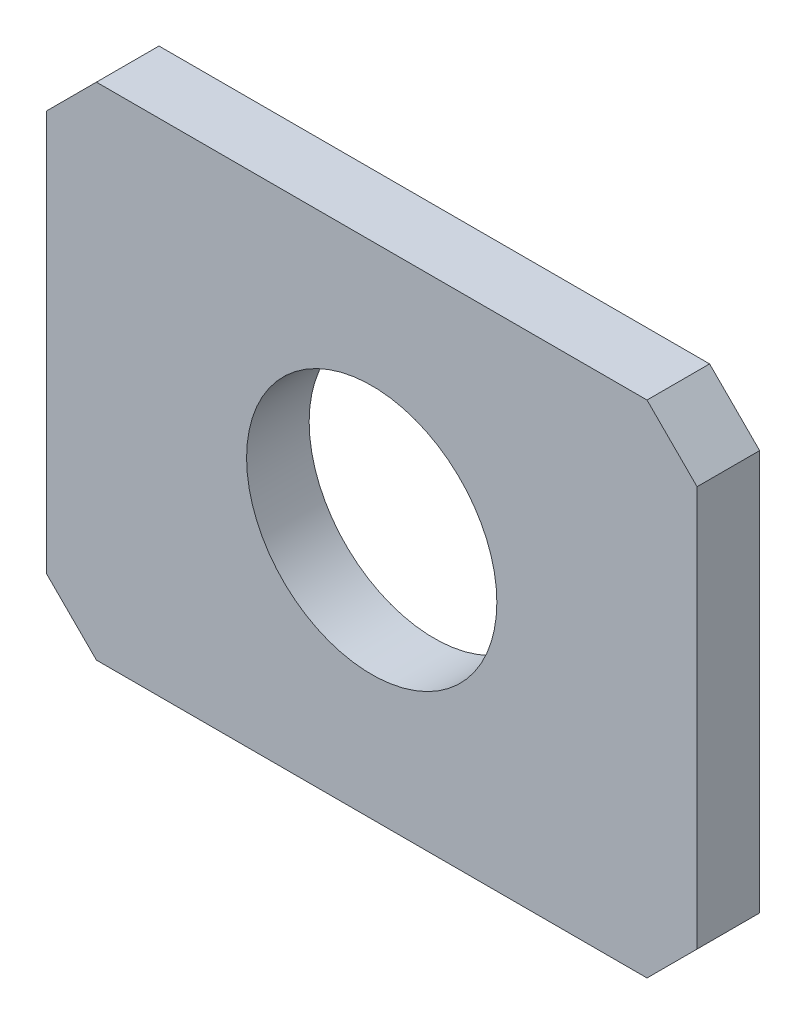
ISO-10303-21;
HEADER;
FILE_DESCRIPTION(('STEP AP214'),'2;1');
FILE_NAME('part.step','',(''),(''),'','','');
FILE_SCHEMA(('AUTOMOTIVE_DESIGN { 1 0 10303 214 1 1 1 1 }'));
ENDSEC;
DATA;
#1=APPLICATION_CONTEXT('core data for automotive mechanical design processes');
#2=APPLICATION_PROTOCOL_DEFINITION('international standard','automotive_design',2000,#1);
#3=PRODUCT_CONTEXT('',#1,'mechanical');
#4=PRODUCT('Part','Part','',(#3));
#5=PRODUCT_RELATED_PRODUCT_CATEGORY('part','',(#4));
#6=PRODUCT_DEFINITION_FORMATION('','',#4);
#7=PRODUCT_DEFINITION_CONTEXT('part definition',#1,'design');
#8=PRODUCT_DEFINITION('design','',#6,#7);
#9=PRODUCT_DEFINITION_SHAPE('','',#8);
#10=(LENGTH_UNIT() NAMED_UNIT(*) SI_UNIT(.MILLI.,.METRE.));
#11=(NAMED_UNIT(*) PLANE_ANGLE_UNIT() SI_UNIT($,.RADIAN.));
#12=(NAMED_UNIT(*) SI_UNIT($,.STERADIAN.) SOLID_ANGLE_UNIT());
#13=UNCERTAINTY_MEASURE_WITH_UNIT(LENGTH_MEASURE(1.E-05),#10,'distance_accuracy_value','');
#14=(GEOMETRIC_REPRESENTATION_CONTEXT(3) GLOBAL_UNCERTAINTY_ASSIGNED_CONTEXT((#13)) GLOBAL_UNIT_ASSIGNED_CONTEXT((#10,
#11,#12)) REPRESENTATION_CONTEXT('',''));
#15=CARTESIAN_POINT('',(0.,0.,0.));
#16=DIRECTION('',(0.,0.,1.));
#17=DIRECTION('',(1.,0.,0.));
#18=AXIS2_PLACEMENT_3D('',#15,#16,#17);
#19=CARTESIAN_POINT('',(78.,-60.,15.));
#20=DIRECTION('',(-1.,0.,0.));
#21=DIRECTION('',(0.,0.,1.));
#22=AXIS2_PLACEMENT_3D('',#19,#20,#21);
#23=PLANE('',#22);
#24=DIRECTION('',(0.,1.,0.));
#25=VECTOR('',#24,1.);
#26=CARTESIAN_POINT('',(78.,-60.,15.));
#27=LINE('',#26,#25);
#28=CARTESIAN_POINT('',(78.,-48.,15.));
#29=VERTEX_POINT('',#28);
#30=CARTESIAN_POINT('',(78.,48.,15.));
#31=VERTEX_POINT('',#30);
#32=EDGE_CURVE('E125',#29,#31,#27,.T.);
#33=ORIENTED_EDGE('',*,*,#32,.F.);
#34=DIRECTION('',(0.,0.,-1.));
#35=VECTOR('',#34,1.);
#36=CARTESIAN_POINT('',(78.,-48.,15.));
#37=LINE('',#36,#35);
#38=CARTESIAN_POINT('',(78.,-48.,0.));
#39=VERTEX_POINT('',#38);
#40=EDGE_CURVE('E151',#29,#39,#37,.T.);
#41=ORIENTED_EDGE('',*,*,#40,.T.);
#42=DIRECTION('',(0.,1.,0.));
#43=VECTOR('',#42,1.);
#44=CARTESIAN_POINT('',(78.,-60.,0.));
#45=LINE('',#44,#43);
#46=CARTESIAN_POINT('',(78.,48.,0.));
#47=VERTEX_POINT('',#46);
#48=EDGE_CURVE('E157',#39,#47,#45,.T.);
#49=ORIENTED_EDGE('',*,*,#48,.T.);
#50=DIRECTION('',(0.,0.,1.));
#51=VECTOR('',#50,1.);
#52=CARTESIAN_POINT('',(78.,48.,15.));
#53=LINE('',#52,#51);
#54=EDGE_CURVE('E149',#47,#31,#53,.T.);
#55=ORIENTED_EDGE('',*,*,#54,.T.);
#56=EDGE_LOOP('',(#33,#41,#49,#55));
#57=FACE_BOUND('',#56,.T.);
#58=ADVANCED_FACE('F33',(#57),#23,.F.);
#59=CARTESIAN_POINT('',(-78.,60.,15.));
#60=DIRECTION('',(0.,-1.,0.));
#61=DIRECTION('',(0.,0.,-1.));
#62=AXIS2_PLACEMENT_3D('',#59,#60,#61);
#63=PLANE('',#62);
#64=DIRECTION('',(-1.,0.,0.));
#65=VECTOR('',#64,1.);
#66=CARTESIAN_POINT('',(-78.,60.,15.));
#67=LINE('',#66,#65);
#68=CARTESIAN_POINT('',(66.,60.,15.));
#69=VERTEX_POINT('',#68);
#70=CARTESIAN_POINT('',(-66.,60.,15.));
#71=VERTEX_POINT('',#70);
#72=EDGE_CURVE('E128',#69,#71,#67,.T.);
#73=ORIENTED_EDGE('',*,*,#72,.F.);
#74=DIRECTION('',(0.,0.,-1.));
#75=VECTOR('',#74,1.);
#76=CARTESIAN_POINT('',(66.,60.,15.));
#77=LINE('',#76,#75);
#78=CARTESIAN_POINT('',(66.,60.,0.));
#79=VERTEX_POINT('',#78);
#80=EDGE_CURVE('E11',#69,#79,#77,.T.);
#81=ORIENTED_EDGE('',*,*,#80,.T.);
#82=DIRECTION('',(-1.,0.,0.));
#83=VECTOR('',#82,1.);
#84=CARTESIAN_POINT('',(-78.,60.,0.));
#85=LINE('',#84,#83);
#86=CARTESIAN_POINT('',(-66.,60.,0.));
#87=VERTEX_POINT('',#86);
#88=EDGE_CURVE('E130',#79,#87,#85,.T.);
#89=ORIENTED_EDGE('',*,*,#88,.T.);
#90=DIRECTION('',(0.,0.,1.));
#91=VECTOR('',#90,1.);
#92=CARTESIAN_POINT('',(-66.,60.,15.));
#93=LINE('',#92,#91);
#94=EDGE_CURVE('E41',#87,#71,#93,.T.);
#95=ORIENTED_EDGE('',*,*,#94,.T.);
#96=EDGE_LOOP('',(#73,#81,#89,#95));
#97=FACE_BOUND('',#96,.T.);
#98=ADVANCED_FACE('F187',(#97),#63,.F.);
#99=CARTESIAN_POINT('',(-78.,-60.,15.));
#100=DIRECTION('',(1.,0.,0.));
#101=DIRECTION('',(0.,0.,-1.));
#102=AXIS2_PLACEMENT_3D('',#99,#100,#101);
#103=PLANE('',#102);
#104=DIRECTION('',(0.,-1.,0.));
#105=VECTOR('',#104,1.);
#106=CARTESIAN_POINT('',(-78.,-60.,0.));
#107=LINE('',#106,#105);
#108=CARTESIAN_POINT('',(-78.,48.,0.));
#109=VERTEX_POINT('',#108);
#110=CARTESIAN_POINT('',(-78.,-48.,0.));
#111=VERTEX_POINT('',#110);
#112=EDGE_CURVE('E126',#109,#111,#107,.T.);
#113=ORIENTED_EDGE('',*,*,#112,.T.);
#114=DIRECTION('',(0.,0.,1.));
#115=VECTOR('',#114,1.);
#116=CARTESIAN_POINT('',(-78.,-48.,15.));
#117=LINE('',#116,#115);
#118=CARTESIAN_POINT('',(-78.,-48.,15.));
#119=VERTEX_POINT('',#118);
#120=EDGE_CURVE('E104',#111,#119,#117,.T.);
#121=ORIENTED_EDGE('',*,*,#120,.T.);
#122=DIRECTION('',(0.,-1.,0.));
#123=VECTOR('',#122,1.);
#124=CARTESIAN_POINT('',(-78.,-60.,15.));
#125=LINE('',#124,#123);
#126=CARTESIAN_POINT('',(-78.,48.,15.));
#127=VERTEX_POINT('',#126);
#128=EDGE_CURVE('E169',#127,#119,#125,.T.);
#129=ORIENTED_EDGE('',*,*,#128,.F.);
#130=DIRECTION('',(0.,0.,-1.));
#131=VECTOR('',#130,1.);
#132=CARTESIAN_POINT('',(-78.,48.,15.));
#133=LINE('',#132,#131);
#134=EDGE_CURVE('E109',#127,#109,#133,.T.);
#135=ORIENTED_EDGE('',*,*,#134,.T.);
#136=EDGE_LOOP('',(#113,#121,#129,#135));
#137=FACE_BOUND('',#136,.T.);
#138=ADVANCED_FACE('F185',(#137),#103,.F.);
#139=CARTESIAN_POINT('',(-78.,-60.,15.));
#140=DIRECTION('',(0.,1.,0.));
#141=DIRECTION('',(0.,0.,1.));
#142=AXIS2_PLACEMENT_3D('',#139,#140,#141);
#143=PLANE('',#142);
#144=DIRECTION('',(1.,0.,0.));
#145=VECTOR('',#144,1.);
#146=CARTESIAN_POINT('',(-78.,-60.,15.));
#147=LINE('',#146,#145);
#148=CARTESIAN_POINT('',(-66.,-60.,15.));
#149=VERTEX_POINT('',#148);
#150=CARTESIAN_POINT('',(66.,-60.,15.));
#151=VERTEX_POINT('',#150);
#152=EDGE_CURVE('E119',#149,#151,#147,.T.);
#153=ORIENTED_EDGE('',*,*,#152,.F.);
#154=DIRECTION('',(0.,0.,-1.));
#155=VECTOR('',#154,1.);
#156=CARTESIAN_POINT('',(-66.,-60.,15.));
#157=LINE('',#156,#155);
#158=CARTESIAN_POINT('',(-66.,-60.,0.));
#159=VERTEX_POINT('',#158);
#160=EDGE_CURVE('E103',#149,#159,#157,.T.);
#161=ORIENTED_EDGE('',*,*,#160,.T.);
#162=DIRECTION('',(1.,0.,0.));
#163=VECTOR('',#162,1.);
#164=CARTESIAN_POINT('',(-78.,-60.,0.));
#165=LINE('',#164,#163);
#166=CARTESIAN_POINT('',(66.,-60.,0.));
#167=VERTEX_POINT('',#166);
#168=EDGE_CURVE('E116',#159,#167,#165,.T.);
#169=ORIENTED_EDGE('',*,*,#168,.T.);
#170=DIRECTION('',(0.,0.,1.));
#171=VECTOR('',#170,1.);
#172=CARTESIAN_POINT('',(66.,-60.,15.));
#173=LINE('',#172,#171);
#174=EDGE_CURVE('E121',#167,#151,#173,.T.);
#175=ORIENTED_EDGE('',*,*,#174,.T.);
#176=EDGE_LOOP('',(#153,#161,#169,#175));
#177=FACE_BOUND('',#176,.T.);
#178=ADVANCED_FACE('F115',(#177),#143,.F.);
#179=CARTESIAN_POINT('',(0.,0.,15.));
#180=DIRECTION('',(0.,0.,-1.));
#181=DIRECTION('',(-1.,0.,0.));
#182=AXIS2_PLACEMENT_3D('',#179,#180,#181);
#183=PLANE('',#182);
#184=CARTESIAN_POINT('',(0.,0.,15.));
#185=DIRECTION('',(0.,0.,1.));
#186=DIRECTION('',(1.,0.,0.));
#187=AXIS2_PLACEMENT_3D('',#184,#185,#186);
#188=CIRCLE('',#187,30.);
#189=CARTESIAN_POINT('',(30.,0.,15.));
#190=VERTEX_POINT('',#189);
#191=EDGE_CURVE('E165',#190,#190,#188,.T.);
#192=ORIENTED_EDGE('',*,*,#191,.F.);
#193=EDGE_LOOP('',(#192));
#194=FACE_BOUND('',#193,.T.);
#195=ORIENTED_EDGE('',*,*,#128,.T.);
#196=DIRECTION('',(-0.707106781186547,0.707106781186548,0.));
#197=VECTOR('',#196,1.);
#198=CARTESIAN_POINT('',(-66.,-60.,15.));
#199=LINE('',#198,#197);
#200=EDGE_CURVE('E147',#119,#149,#199,.F.);
#201=ORIENTED_EDGE('',*,*,#200,.T.);
#202=ORIENTED_EDGE('',*,*,#152,.T.);
#203=DIRECTION('',(-0.707106781186548,-0.707106781186547,0.));
#204=VECTOR('',#203,1.);
#205=CARTESIAN_POINT('',(78.,-48.,15.));
#206=LINE('',#205,#204);
#207=EDGE_CURVE('E145',#151,#29,#206,.F.);
#208=ORIENTED_EDGE('',*,*,#207,.T.);
#209=ORIENTED_EDGE('',*,*,#32,.T.);
#210=DIRECTION('',(0.707106781186547,-0.707106781186548,0.));
#211=VECTOR('',#210,1.);
#212=CARTESIAN_POINT('',(66.,60.,15.));
#213=LINE('',#212,#211);
#214=EDGE_CURVE('E54',#31,#69,#213,.F.);
#215=ORIENTED_EDGE('',*,*,#214,.T.);
#216=ORIENTED_EDGE('',*,*,#72,.T.);
#217=DIRECTION('',(0.707106781186548,0.707106781186547,0.));
#218=VECTOR('',#217,1.);
#219=CARTESIAN_POINT('',(-78.,48.,15.));
#220=LINE('',#219,#218);
#221=EDGE_CURVE('E142',#71,#127,#220,.F.);
#222=ORIENTED_EDGE('',*,*,#221,.T.);
#223=EDGE_LOOP('',(#195,#201,#202,#208,#209,#215,#216,#222));
#224=FACE_BOUND('',#223,.T.);
#225=ADVANCED_FACE('F178',(#194,#224),#183,.F.);
#226=CARTESIAN_POINT('',(0.,0.,0.));
#227=DIRECTION('',(0.,0.,-1.));
#228=DIRECTION('',(-1.,0.,0.));
#229=AXIS2_PLACEMENT_3D('',#226,#227,#228);
#230=PLANE('',#229);
#231=CARTESIAN_POINT('',(0.,0.,0.));
#232=DIRECTION('',(0.,0.,1.));
#233=DIRECTION('',(1.,0.,0.));
#234=AXIS2_PLACEMENT_3D('',#231,#232,#233);
#235=CIRCLE('',#234,30.);
#236=CARTESIAN_POINT('',(30.,0.,0.));
#237=VERTEX_POINT('',#236);
#238=EDGE_CURVE('E162',#237,#237,#235,.T.);
#239=ORIENTED_EDGE('',*,*,#238,.T.);
#240=EDGE_LOOP('',(#239));
#241=FACE_BOUND('',#240,.T.);
#242=ORIENTED_EDGE('',*,*,#168,.F.);
#243=DIRECTION('',(0.707106781186547,-0.707106781186548,0.));
#244=VECTOR('',#243,1.);
#245=CARTESIAN_POINT('',(-63.0000000000001,-62.9999999999999,0.));
#246=LINE('',#245,#244);
#247=EDGE_CURVE('E99',#159,#111,#246,.F.);
#248=ORIENTED_EDGE('',*,*,#247,.T.);
#249=ORIENTED_EDGE('',*,*,#112,.F.);
#250=DIRECTION('',(-0.707106781186548,-0.707106781186547,0.));
#251=VECTOR('',#250,1.);
#252=CARTESIAN_POINT('',(-62.9999999999999,63.,0.));
#253=LINE('',#252,#251);
#254=EDGE_CURVE('E120',#109,#87,#253,.F.);
#255=ORIENTED_EDGE('',*,*,#254,.T.);
#256=ORIENTED_EDGE('',*,*,#88,.F.);
#257=DIRECTION('',(-0.707106781186547,0.707106781186548,0.));
#258=VECTOR('',#257,1.);
#259=CARTESIAN_POINT('',(63.0000000000001,62.9999999999999,0.));
#260=LINE('',#259,#258);
#261=EDGE_CURVE('E136',#79,#47,#260,.F.);
#262=ORIENTED_EDGE('',*,*,#261,.T.);
#263=ORIENTED_EDGE('',*,*,#48,.F.);
#264=DIRECTION('',(0.707106781186548,0.707106781186547,0.));
#265=VECTOR('',#264,1.);
#266=CARTESIAN_POINT('',(62.9999999999999,-63.0000000000001,0.));
#267=LINE('',#266,#265);
#268=EDGE_CURVE('E110',#39,#167,#267,.F.);
#269=ORIENTED_EDGE('',*,*,#268,.T.);
#270=EDGE_LOOP('',(#242,#248,#249,#255,#256,#262,#263,#269));
#271=FACE_BOUND('',#270,.T.);
#272=ADVANCED_FACE('F123',(#241,#271),#230,.T.);
#273=CARTESIAN_POINT('',(0.,0.,0.));
#274=DIRECTION('',(0.,0.,1.));
#275=DIRECTION('',(1.,0.,0.));
#276=AXIS2_PLACEMENT_3D('',#273,#274,#275);
#277=CYLINDRICAL_SURFACE('',#276,30.);
#278=ORIENTED_EDGE('',*,*,#238,.F.);
#279=EDGE_LOOP('',(#278));
#280=FACE_BOUND('',#279,.T.);
#281=ORIENTED_EDGE('',*,*,#191,.T.);
#282=EDGE_LOOP('',(#281));
#283=FACE_BOUND('',#282,.T.);
#284=ADVANCED_FACE('F176',(#280,#283),#277,.F.);
#285=CARTESIAN_POINT('',(-66.,-60.,15.));
#286=DIRECTION('',(0.707106781186548,0.707106781186547,0.));
#287=DIRECTION('',(0.,0.,-1.));
#288=AXIS2_PLACEMENT_3D('',#285,#286,#287);
#289=PLANE('',#288);
#290=ORIENTED_EDGE('',*,*,#200,.F.);
#291=ORIENTED_EDGE('',*,*,#120,.F.);
#292=ORIENTED_EDGE('',*,*,#247,.F.);
#293=ORIENTED_EDGE('',*,*,#160,.F.);
#294=EDGE_LOOP('',(#290,#291,#292,#293));
#295=FACE_BOUND('',#294,.T.);
#296=ADVANCED_FACE('F102',(#295),#289,.F.);
#297=CARTESIAN_POINT('',(78.,-48.,15.));
#298=DIRECTION('',(-0.707106781186547,0.707106781186548,0.));
#299=DIRECTION('',(0.,0.,-1.));
#300=AXIS2_PLACEMENT_3D('',#297,#298,#299);
#301=PLANE('',#300);
#302=ORIENTED_EDGE('',*,*,#207,.F.);
#303=ORIENTED_EDGE('',*,*,#174,.F.);
#304=ORIENTED_EDGE('',*,*,#268,.F.);
#305=ORIENTED_EDGE('',*,*,#40,.F.);
#306=EDGE_LOOP('',(#302,#303,#304,#305));
#307=FACE_BOUND('',#306,.T.);
#308=ADVANCED_FACE('F191',(#307),#301,.F.);
#309=CARTESIAN_POINT('',(66.,60.,15.));
#310=DIRECTION('',(-0.707106781186548,-0.707106781186547,0.));
#311=DIRECTION('',(0.,0.,-1.));
#312=AXIS2_PLACEMENT_3D('',#309,#310,#311);
#313=PLANE('',#312);
#314=ORIENTED_EDGE('',*,*,#214,.F.);
#315=ORIENTED_EDGE('',*,*,#54,.F.);
#316=ORIENTED_EDGE('',*,*,#261,.F.);
#317=ORIENTED_EDGE('',*,*,#80,.F.);
#318=EDGE_LOOP('',(#314,#315,#316,#317));
#319=FACE_BOUND('',#318,.T.);
#320=ADVANCED_FACE('F190',(#319),#313,.F.);
#321=CARTESIAN_POINT('',(-78.,48.,15.));
#322=DIRECTION('',(0.707106781186547,-0.707106781186548,0.));
#323=DIRECTION('',(0.,0.,-1.));
#324=AXIS2_PLACEMENT_3D('',#321,#322,#323);
#325=PLANE('',#324);
#326=ORIENTED_EDGE('',*,*,#221,.F.);
#327=ORIENTED_EDGE('',*,*,#94,.F.);
#328=ORIENTED_EDGE('',*,*,#254,.F.);
#329=ORIENTED_EDGE('',*,*,#134,.F.);
#330=EDGE_LOOP('',(#326,#327,#328,#329));
#331=FACE_BOUND('',#330,.T.);
#332=ADVANCED_FACE('F35',(#331),#325,.F.);
#333=CLOSED_SHELL('',(#58,#98,#138,#178,#225,#272,#284,#296,#308,#320,#332));
#334=MANIFOLD_SOLID_BREP('B2',#333);
#335=ADVANCED_BREP_SHAPE_REPRESENTATION('',(#18,#334),#14);
#336=SHAPE_DEFINITION_REPRESENTATION(#9,#335);
ENDSEC;
END-ISO-10303-21;
